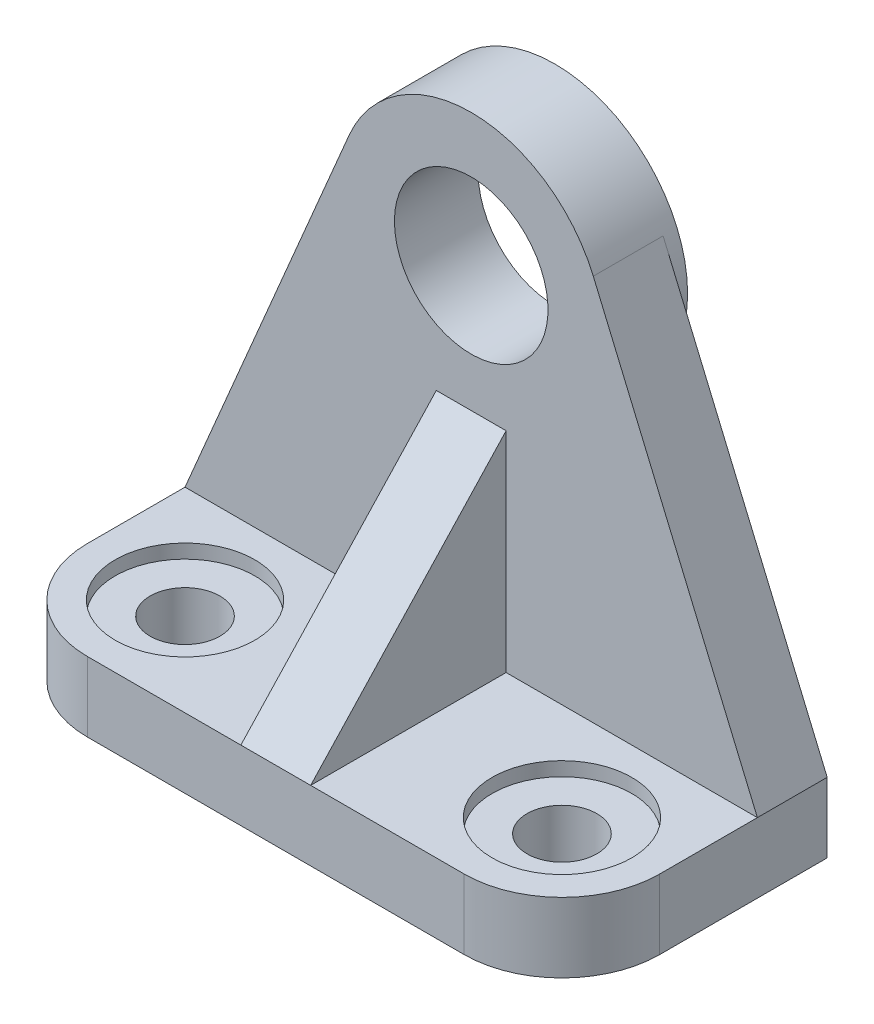
ISO-10303-21;
HEADER;
FILE_DESCRIPTION(('STEP AP214'),'2;1');
FILE_NAME('part.step','',(''),(''),'','','');
FILE_SCHEMA(('AUTOMOTIVE_DESIGN { 1 0 10303 214 1 1 1 1 }'));
ENDSEC;
DATA;
#1=APPLICATION_CONTEXT('core data for automotive mechanical design processes');
#2=APPLICATION_PROTOCOL_DEFINITION('international standard','automotive_design',2000,#1);
#3=PRODUCT_CONTEXT('',#1,'mechanical');
#4=PRODUCT('Part','Part','',(#3));
#5=PRODUCT_RELATED_PRODUCT_CATEGORY('part','',(#4));
#6=PRODUCT_DEFINITION_FORMATION('','',#4);
#7=PRODUCT_DEFINITION_CONTEXT('part definition',#1,'design');
#8=PRODUCT_DEFINITION('design','',#6,#7);
#9=PRODUCT_DEFINITION_SHAPE('','',#8);
#10=(LENGTH_UNIT() NAMED_UNIT(*) SI_UNIT(.MILLI.,.METRE.));
#11=(NAMED_UNIT(*) PLANE_ANGLE_UNIT() SI_UNIT($,.RADIAN.));
#12=(NAMED_UNIT(*) SI_UNIT($,.STERADIAN.) SOLID_ANGLE_UNIT());
#13=UNCERTAINTY_MEASURE_WITH_UNIT(LENGTH_MEASURE(1.E-05),#10,'distance_accuracy_value','');
#14=(GEOMETRIC_REPRESENTATION_CONTEXT(3) GLOBAL_UNCERTAINTY_ASSIGNED_CONTEXT((#13)) GLOBAL_UNIT_ASSIGNED_CONTEXT((#10,
#11,#12)) REPRESENTATION_CONTEXT('',''));
#15=CARTESIAN_POINT('',(0.,0.,0.));
#16=DIRECTION('',(0.,0.,1.));
#17=DIRECTION('',(1.,0.,0.));
#18=AXIS2_PLACEMENT_3D('',#15,#16,#17);
#19=CARTESIAN_POINT('',(0.,10.,0.));
#20=DIRECTION('',(0.,1.,0.));
#21=DIRECTION('',(0.,0.,1.));
#22=AXIS2_PLACEMENT_3D('',#19,#20,#21);
#23=PLANE('',#22);
#24=CARTESIAN_POINT('',(-27.,10.,5.));
#25=DIRECTION('',(0.,1.,0.));
#26=DIRECTION('',(0.,0.,1.));
#27=AXIS2_PLACEMENT_3D('',#24,#25,#26);
#28=CIRCLE('',#27,10.);
#29=CARTESIAN_POINT('',(-27.,10.,15.));
#30=VERTEX_POINT('',#29);
#31=EDGE_CURVE('E158',#30,#30,#28,.T.);
#32=ORIENTED_EDGE('',*,*,#31,.F.);
#33=EDGE_LOOP('',(#32));
#34=FACE_BOUND('',#33,.T.);
#35=DIRECTION('',(1.,0.,0.));
#36=VECTOR('',#35,1.);
#37=CARTESIAN_POINT('',(-41.,10.,19.));
#38=LINE('',#37,#36);
#39=CARTESIAN_POINT('',(-27.,10.,19.));
#40=VERTEX_POINT('',#39);
#41=CARTESIAN_POINT('',(-5.,10.,19.));
#42=VERTEX_POINT('',#41);
#43=EDGE_CURVE('E137',#40,#42,#38,.T.);
#44=ORIENTED_EDGE('',*,*,#43,.T.);
#45=DIRECTION('',(0.,0.,-1.));
#46=VECTOR('',#45,1.);
#47=CARTESIAN_POINT('',(-5.,10.,0.));
#48=LINE('',#47,#46);
#49=CARTESIAN_POINT('',(-5.,10.,-9.));
#50=VERTEX_POINT('',#49);
#51=EDGE_CURVE('E136',#42,#50,#48,.T.);
#52=ORIENTED_EDGE('',*,*,#51,.T.);
#53=DIRECTION('',(1.,0.,0.));
#54=VECTOR('',#53,1.);
#55=CARTESIAN_POINT('',(0.,10.,-9.));
#56=LINE('',#55,#54);
#57=CARTESIAN_POINT('',(-41.,10.,-9.));
#58=VERTEX_POINT('',#57);
#59=EDGE_CURVE('E122',#58,#50,#56,.T.);
#60=ORIENTED_EDGE('',*,*,#59,.F.);
#61=DIRECTION('',(0.,0.,1.));
#62=VECTOR('',#61,1.);
#63=CARTESIAN_POINT('',(-41.,10.,-19.));
#64=LINE('',#63,#62);
#65=CARTESIAN_POINT('',(-41.,10.,5.));
#66=VERTEX_POINT('',#65);
#67=EDGE_CURVE('E201',#58,#66,#64,.T.);
#68=ORIENTED_EDGE('',*,*,#67,.T.);
#69=CARTESIAN_POINT('',(-27.,10.,5.));
#70=DIRECTION('',(0.,1.,0.));
#71=DIRECTION('',(0.,0.,1.));
#72=AXIS2_PLACEMENT_3D('',#69,#70,#71);
#73=CIRCLE('',#72,14.);
#74=EDGE_CURVE('E235',#66,#40,#73,.T.);
#75=ORIENTED_EDGE('',*,*,#74,.T.);
#76=EDGE_LOOP('',(#44,#52,#60,#68,#75));
#77=FACE_BOUND('',#76,.T.);
#78=ADVANCED_FACE('F33',(#34,#77),#23,.T.);
#79=CARTESIAN_POINT('',(41.,10.,-19.));
#80=DIRECTION('',(-1.,0.,0.));
#81=DIRECTION('',(0.,0.,1.));
#82=AXIS2_PLACEMENT_3D('',#79,#80,#81);
#83=PLANE('',#82);
#84=DIRECTION('',(0.,0.,-1.));
#85=VECTOR('',#84,1.);
#86=CARTESIAN_POINT('',(41.,10.,-19.));
#87=LINE('',#86,#85);
#88=CARTESIAN_POINT('',(41.,10.,5.));
#89=VERTEX_POINT('',#88);
#90=CARTESIAN_POINT('',(41.,10.,-9.));
#91=VERTEX_POINT('',#90);
#92=EDGE_CURVE('E198',#89,#91,#87,.T.);
#93=ORIENTED_EDGE('',*,*,#92,.F.);
#94=DIRECTION('',(0.,-1.,0.));
#95=VECTOR('',#94,1.);
#96=CARTESIAN_POINT('',(41.,10.,5.));
#97=LINE('',#96,#95);
#98=CARTESIAN_POINT('',(41.,0.,5.));
#99=VERTEX_POINT('',#98);
#100=EDGE_CURVE('E221',#89,#99,#97,.T.);
#101=ORIENTED_EDGE('',*,*,#100,.T.);
#102=DIRECTION('',(0.,0.,-1.));
#103=VECTOR('',#102,1.);
#104=CARTESIAN_POINT('',(41.,0.,-19.));
#105=LINE('',#104,#103);
#106=CARTESIAN_POINT('',(41.,0.,-19.));
#107=VERTEX_POINT('',#106);
#108=EDGE_CURVE('E193',#99,#107,#105,.T.);
#109=ORIENTED_EDGE('',*,*,#108,.T.);
#110=DIRECTION('',(0.,-1.,0.));
#111=VECTOR('',#110,1.);
#112=CARTESIAN_POINT('',(41.,10.,-19.));
#113=LINE('',#112,#111);
#114=CARTESIAN_POINT('',(41.,10.,-19.));
#115=VERTEX_POINT('',#114);
#116=EDGE_CURVE('E218',#115,#107,#113,.T.);
#117=ORIENTED_EDGE('',*,*,#116,.F.);
#118=DIRECTION('',(0.,0.,-1.));
#119=VECTOR('',#118,1.);
#120=CARTESIAN_POINT('',(41.,10.,-9.));
#121=LINE('',#120,#119);
#122=EDGE_CURVE('E190',#91,#115,#121,.T.);
#123=ORIENTED_EDGE('',*,*,#122,.F.);
#124=EDGE_LOOP('',(#93,#101,#109,#117,#123));
#125=FACE_BOUND('',#124,.T.);
#126=ADVANCED_FACE('F244',(#125),#83,.F.);
#127=CARTESIAN_POINT('',(-41.,10.,-19.));
#128=DIRECTION('',(0.,0.,1.));
#129=DIRECTION('',(1.,0.,0.));
#130=AXIS2_PLACEMENT_3D('',#127,#128,#129);
#131=PLANE('',#130);
#132=DIRECTION('',(-1.,0.,0.));
#133=VECTOR('',#132,1.);
#134=CARTESIAN_POINT('',(-41.,0.,-19.));
#135=LINE('',#134,#133);
#136=CARTESIAN_POINT('',(-41.,0.,-19.));
#137=VERTEX_POINT('',#136);
#138=EDGE_CURVE('E210',#107,#137,#135,.T.);
#139=ORIENTED_EDGE('',*,*,#138,.T.);
#140=DIRECTION('',(0.,-1.,0.));
#141=VECTOR('',#140,1.);
#142=CARTESIAN_POINT('',(-41.,10.,-19.));
#143=LINE('',#142,#141);
#144=CARTESIAN_POINT('',(-41.,10.,-19.));
#145=VERTEX_POINT('',#144);
#146=EDGE_CURVE('E208',#145,#137,#143,.T.);
#147=ORIENTED_EDGE('',*,*,#146,.F.);
#148=DIRECTION('',(0.390511010966112,0.920598256740814,0.));
#149=VECTOR('',#148,1.);
#150=CARTESIAN_POINT('',(-38.3425847222182,16.2646424901311,-19.));
#151=LINE('',#150,#149);
#152=CARTESIAN_POINT('',(-17.4913668780755,65.4197092083561,-19.));
#153=VERTEX_POINT('',#152);
#154=EDGE_CURVE('E176',#145,#153,#151,.T.);
#155=ORIENTED_EDGE('',*,*,#154,.T.);
#156=CARTESIAN_POINT('',(0.,58.,-19.));
#157=DIRECTION('',(0.,0.,-1.));
#158=DIRECTION('',(-1.,0.,0.));
#159=AXIS2_PLACEMENT_3D('',#156,#157,#158);
#160=CIRCLE('',#159,19.);
#161=CARTESIAN_POINT('',(17.4913668780755,65.4197092083561,-19.));
#162=VERTEX_POINT('',#161);
#163=EDGE_CURVE('E185',#162,#153,#160,.T.);
#164=ORIENTED_EDGE('',*,*,#163,.F.);
#165=DIRECTION('',(-0.390511010966112,0.920598256740814,0.));
#166=VECTOR('',#165,1.);
#167=CARTESIAN_POINT('',(38.3425847222182,16.264642490131,-19.));
#168=LINE('',#167,#166);
#169=EDGE_CURVE('E187',#115,#162,#168,.T.);
#170=ORIENTED_EDGE('',*,*,#169,.F.);
#171=ORIENTED_EDGE('',*,*,#116,.T.);
#172=EDGE_LOOP('',(#139,#147,#155,#164,#170,#171));
#173=FACE_BOUND('',#172,.T.);
#174=ADVANCED_FACE('F257',(#173),#131,.F.);
#175=CARTESIAN_POINT('',(-41.,10.,-19.));
#176=DIRECTION('',(1.,0.,0.));
#177=DIRECTION('',(0.,0.,-1.));
#178=AXIS2_PLACEMENT_3D('',#175,#176,#177);
#179=PLANE('',#178);
#180=DIRECTION('',(0.,0.,1.));
#181=VECTOR('',#180,1.);
#182=CARTESIAN_POINT('',(-41.,0.,-19.));
#183=LINE('',#182,#181);
#184=CARTESIAN_POINT('',(-41.,0.,5.));
#185=VERTEX_POINT('',#184);
#186=EDGE_CURVE('E212',#137,#185,#183,.T.);
#187=ORIENTED_EDGE('',*,*,#186,.T.);
#188=DIRECTION('',(0.,-1.,0.));
#189=VECTOR('',#188,1.);
#190=CARTESIAN_POINT('',(-41.,10.,5.));
#191=LINE('',#190,#189);
#192=EDGE_CURVE('E11',#185,#66,#191,.F.);
#193=ORIENTED_EDGE('',*,*,#192,.T.);
#194=ORIENTED_EDGE('',*,*,#67,.F.);
#195=EDGE_CURVE('E203',#145,#58,#64,.T.);
#196=ORIENTED_EDGE('',*,*,#195,.F.);
#197=ORIENTED_EDGE('',*,*,#146,.T.);
#198=EDGE_LOOP('',(#187,#193,#194,#196,#197));
#199=FACE_BOUND('',#198,.T.);
#200=ADVANCED_FACE('F478',(#199),#179,.F.);
#201=CARTESIAN_POINT('',(-41.,10.,19.));
#202=DIRECTION('',(0.,0.,-1.));
#203=DIRECTION('',(-1.,0.,0.));
#204=AXIS2_PLACEMENT_3D('',#201,#202,#203);
#205=PLANE('',#204);
#206=CARTESIAN_POINT('',(5.,10.,19.));
#207=VERTEX_POINT('',#206);
#208=CARTESIAN_POINT('',(27.,10.,19.));
#209=VERTEX_POINT('',#208);
#210=EDGE_CURVE('E206',#207,#209,#38,.T.);
#211=ORIENTED_EDGE('',*,*,#210,.F.);
#212=DIRECTION('',(-1.,0.,0.));
#213=VECTOR('',#212,1.);
#214=CARTESIAN_POINT('',(0.,10.,19.));
#215=LINE('',#214,#213);
#216=EDGE_CURVE('E55',#42,#207,#215,.F.);
#217=ORIENTED_EDGE('',*,*,#216,.F.);
#218=ORIENTED_EDGE('',*,*,#43,.F.);
#219=DIRECTION('',(0.,-1.,0.));
#220=VECTOR('',#219,1.);
#221=CARTESIAN_POINT('',(-27.,10.,19.));
#222=LINE('',#221,#220);
#223=CARTESIAN_POINT('',(-27.,0.,19.));
#224=VERTEX_POINT('',#223);
#225=EDGE_CURVE('E229',#40,#224,#222,.T.);
#226=ORIENTED_EDGE('',*,*,#225,.T.);
#227=DIRECTION('',(1.,0.,0.));
#228=VECTOR('',#227,1.);
#229=CARTESIAN_POINT('',(-41.,0.,19.));
#230=LINE('',#229,#228);
#231=CARTESIAN_POINT('',(27.,0.,19.));
#232=VERTEX_POINT('',#231);
#233=EDGE_CURVE('E202',#224,#232,#230,.T.);
#234=ORIENTED_EDGE('',*,*,#233,.T.);
#235=DIRECTION('',(0.,-1.,0.));
#236=VECTOR('',#235,1.);
#237=CARTESIAN_POINT('',(27.,10.,19.));
#238=LINE('',#237,#236);
#239=EDGE_CURVE('E232',#232,#209,#238,.F.);
#240=ORIENTED_EDGE('',*,*,#239,.T.);
#241=EDGE_LOOP('',(#211,#217,#218,#226,#234,#240));
#242=FACE_BOUND('',#241,.T.);
#243=ADVANCED_FACE('F294',(#242),#205,.F.);
#244=CARTESIAN_POINT('',(27.,10.,5.));
#245=DIRECTION('',(0.,-1.,0.));
#246=DIRECTION('',(0.,0.,1.));
#247=AXIS2_PLACEMENT_3D('',#244,#245,#246);
#248=CIRCLE('',#247,10.);
#249=CARTESIAN_POINT('',(27.,10.,15.));
#250=VERTEX_POINT('',#249);
#251=EDGE_CURVE('E271',#250,#250,#248,.T.);
#252=ORIENTED_EDGE('',*,*,#251,.T.);
#253=EDGE_LOOP('',(#252));
#254=FACE_BOUND('',#253,.T.);
#255=DIRECTION('',(0.,0.,-1.));
#256=VECTOR('',#255,1.);
#257=CARTESIAN_POINT('',(5.,10.,0.));
#258=LINE('',#257,#256);
#259=CARTESIAN_POINT('',(5.,10.,-9.));
#260=VERTEX_POINT('',#259);
#261=EDGE_CURVE('E48',#207,#260,#258,.T.);
#262=ORIENTED_EDGE('',*,*,#261,.F.);
#263=ORIENTED_EDGE('',*,*,#210,.T.);
#264=CARTESIAN_POINT('',(27.,10.,5.));
#265=DIRECTION('',(0.,1.,0.));
#266=DIRECTION('',(0.,0.,1.));
#267=AXIS2_PLACEMENT_3D('',#264,#265,#266);
#268=CIRCLE('',#267,14.);
#269=EDGE_CURVE('E41',#209,#89,#268,.T.);
#270=ORIENTED_EDGE('',*,*,#269,.T.);
#271=ORIENTED_EDGE('',*,*,#92,.T.);
#272=EDGE_CURVE('E133',#260,#91,#56,.T.);
#273=ORIENTED_EDGE('',*,*,#272,.F.);
#274=EDGE_LOOP('',(#262,#263,#270,#271,#273));
#275=FACE_BOUND('',#274,.T.);
#276=ADVANCED_FACE('F238',(#254,#275),#23,.T.);
#277=CARTESIAN_POINT('',(0.,0.,0.));
#278=DIRECTION('',(0.,1.,0.));
#279=DIRECTION('',(0.,0.,1.));
#280=AXIS2_PLACEMENT_3D('',#277,#278,#279);
#281=PLANE('',#280);
#282=CARTESIAN_POINT('',(27.,0.,5.));
#283=DIRECTION('',(0.,-1.,0.));
#284=DIRECTION('',(0.,0.,1.));
#285=AXIS2_PLACEMENT_3D('',#282,#283,#284);
#286=CIRCLE('',#285,5.);
#287=CARTESIAN_POINT('',(27.,0.,10.));
#288=VERTEX_POINT('',#287);
#289=EDGE_CURVE('E274',#288,#288,#286,.T.);
#290=ORIENTED_EDGE('',*,*,#289,.F.);
#291=EDGE_LOOP('',(#290));
#292=FACE_BOUND('',#291,.T.);
#293=CARTESIAN_POINT('',(27.,0.,5.));
#294=DIRECTION('',(0.,1.,0.));
#295=DIRECTION('',(0.,0.,1.));
#296=AXIS2_PLACEMENT_3D('',#293,#294,#295);
#297=CIRCLE('',#296,14.);
#298=EDGE_CURVE('E226',#99,#232,#297,.F.);
#299=ORIENTED_EDGE('',*,*,#298,.T.);
#300=ORIENTED_EDGE('',*,*,#233,.F.);
#301=CARTESIAN_POINT('',(-27.,0.,5.));
#302=DIRECTION('',(0.,1.,0.));
#303=DIRECTION('',(0.,0.,1.));
#304=AXIS2_PLACEMENT_3D('',#301,#302,#303);
#305=CIRCLE('',#304,14.);
#306=EDGE_CURVE('E224',#224,#185,#305,.F.);
#307=ORIENTED_EDGE('',*,*,#306,.T.);
#308=ORIENTED_EDGE('',*,*,#186,.F.);
#309=ORIENTED_EDGE('',*,*,#138,.F.);
#310=ORIENTED_EDGE('',*,*,#108,.F.);
#311=EDGE_LOOP('',(#299,#300,#307,#308,#309,#310));
#312=FACE_BOUND('',#311,.T.);
#313=CARTESIAN_POINT('',(-27.,0.,5.));
#314=DIRECTION('',(0.,1.,0.));
#315=DIRECTION('',(0.,0.,1.));
#316=AXIS2_PLACEMENT_3D('',#313,#314,#315);
#317=CIRCLE('',#316,5.);
#318=CARTESIAN_POINT('',(-27.,0.,10.));
#319=VERTEX_POINT('',#318);
#320=EDGE_CURVE('E155',#319,#319,#317,.T.);
#321=ORIENTED_EDGE('',*,*,#320,.T.);
#322=EDGE_LOOP('',(#321));
#323=FACE_BOUND('',#322,.T.);
#324=ADVANCED_FACE('F250',(#292,#312,#323),#281,.F.);
#325=CARTESIAN_POINT('',(38.3425847222182,16.264642490131,-9.));
#326=DIRECTION('',(-0.920598256740814,-0.390511010966112,0.));
#327=DIRECTION('',(0.390511010966112,-0.920598256740814,0.));
#328=AXIS2_PLACEMENT_3D('',#325,#326,#327);
#329=PLANE('',#328);
#330=ORIENTED_EDGE('',*,*,#169,.T.);
#331=DIRECTION('',(0.,0.,-1.));
#332=VECTOR('',#331,1.);
#333=CARTESIAN_POINT('',(17.4913668780755,65.4197092083561,-9.));
#334=LINE('',#333,#332);
#335=CARTESIAN_POINT('',(17.4913668780755,65.4197092083561,-9.));
#336=VERTEX_POINT('',#335);
#337=EDGE_CURVE('E194',#336,#162,#334,.T.);
#338=ORIENTED_EDGE('',*,*,#337,.F.);
#339=DIRECTION('',(-0.390511010966112,0.920598256740814,0.));
#340=VECTOR('',#339,1.);
#341=CARTESIAN_POINT('',(38.3425847222182,16.264642490131,-9.));
#342=LINE('',#341,#340);
#343=EDGE_CURVE('E179',#91,#336,#342,.T.);
#344=ORIENTED_EDGE('',*,*,#343,.F.);
#345=ORIENTED_EDGE('',*,*,#122,.T.);
#346=EDGE_LOOP('',(#330,#338,#344,#345));
#347=FACE_BOUND('',#346,.T.);
#348=ADVANCED_FACE('F260',(#347),#329,.F.);
#349=CARTESIAN_POINT('',(-38.3425847222182,16.2646424901311,-9.));
#350=DIRECTION('',(-0.920598256740814,0.390511010966112,0.));
#351=DIRECTION('',(-0.390511010966112,-0.920598256740814,0.));
#352=AXIS2_PLACEMENT_3D('',#349,#350,#351);
#353=PLANE('',#352);
#354=ORIENTED_EDGE('',*,*,#154,.F.);
#355=ORIENTED_EDGE('',*,*,#195,.T.);
#356=DIRECTION('',(0.390511010966112,0.920598256740814,0.));
#357=VECTOR('',#356,1.);
#358=CARTESIAN_POINT('',(-38.3425847222182,16.2646424901311,-9.));
#359=LINE('',#358,#357);
#360=CARTESIAN_POINT('',(-17.4913668780755,65.4197092083561,-9.));
#361=VERTEX_POINT('',#360);
#362=EDGE_CURVE('E129',#58,#361,#359,.T.);
#363=ORIENTED_EDGE('',*,*,#362,.T.);
#364=DIRECTION('',(0.,0.,-1.));
#365=VECTOR('',#364,1.);
#366=CARTESIAN_POINT('',(-17.4913668780755,65.4197092083561,-9.));
#367=LINE('',#366,#365);
#368=EDGE_CURVE('E182',#361,#153,#367,.T.);
#369=ORIENTED_EDGE('',*,*,#368,.T.);
#370=EDGE_LOOP('',(#354,#355,#363,#369));
#371=FACE_BOUND('',#370,.T.);
#372=ADVANCED_FACE('F292',(#371),#353,.T.);
#373=CARTESIAN_POINT('',(0.,0.,-9.));
#374=DIRECTION('',(0.,0.,-1.));
#375=DIRECTION('',(-1.,0.,0.));
#376=AXIS2_PLACEMENT_3D('',#373,#374,#375);
#377=PLANE('',#376);
#378=CARTESIAN_POINT('',(0.,58.,-9.));
#379=DIRECTION('',(0.,0.,-1.));
#380=DIRECTION('',(-1.,0.,0.));
#381=AXIS2_PLACEMENT_3D('',#378,#379,#380);
#382=CIRCLE('',#381,11.);
#383=CARTESIAN_POINT('',(-11.,58.,-9.));
#384=VERTEX_POINT('',#383);
#385=EDGE_CURVE('E169',#384,#384,#382,.T.);
#386=ORIENTED_EDGE('',*,*,#385,.T.);
#387=EDGE_LOOP('',(#386));
#388=FACE_BOUND('',#387,.T.);
#389=DIRECTION('',(-1.,0.,0.));
#390=VECTOR('',#389,1.);
#391=CARTESIAN_POINT('',(0.,40.,-9.));
#392=LINE('',#391,#390);
#393=CARTESIAN_POINT('',(-5.,40.,-9.));
#394=VERTEX_POINT('',#393);
#395=CARTESIAN_POINT('',(5.,40.,-9.));
#396=VERTEX_POINT('',#395);
#397=EDGE_CURVE('E151',#394,#396,#392,.F.);
#398=ORIENTED_EDGE('',*,*,#397,.T.);
#399=DIRECTION('',(0.,-1.,0.));
#400=VECTOR('',#399,1.);
#401=CARTESIAN_POINT('',(5.,0.,-9.));
#402=LINE('',#401,#400);
#403=EDGE_CURVE('E146',#396,#260,#402,.T.);
#404=ORIENTED_EDGE('',*,*,#403,.T.);
#405=ORIENTED_EDGE('',*,*,#272,.T.);
#406=ORIENTED_EDGE('',*,*,#343,.T.);
#407=CARTESIAN_POINT('',(0.,58.,-9.));
#408=DIRECTION('',(0.,0.,-1.));
#409=DIRECTION('',(-1.,0.,0.));
#410=AXIS2_PLACEMENT_3D('',#407,#408,#409);
#411=CIRCLE('',#410,19.);
#412=EDGE_CURVE('E172',#361,#336,#411,.T.);
#413=ORIENTED_EDGE('',*,*,#412,.F.);
#414=ORIENTED_EDGE('',*,*,#362,.F.);
#415=ORIENTED_EDGE('',*,*,#59,.T.);
#416=DIRECTION('',(0.,-1.,0.));
#417=VECTOR('',#416,1.);
#418=CARTESIAN_POINT('',(-5.,0.,-9.));
#419=LINE('',#418,#417);
#420=EDGE_CURVE('E126',#394,#50,#419,.T.);
#421=ORIENTED_EDGE('',*,*,#420,.F.);
#422=EDGE_LOOP('',(#398,#404,#405,#406,#413,#414,#415,#421));
#423=FACE_BOUND('',#422,.T.);
#424=ADVANCED_FACE('F124',(#388,#423),#377,.F.);
#425=CARTESIAN_POINT('',(0.,58.,-21.));
#426=DIRECTION('',(0.,0.,1.));
#427=DIRECTION('',(1.,0.,0.));
#428=AXIS2_PLACEMENT_3D('',#425,#426,#427);
#429=CYLINDRICAL_SURFACE('',#428,19.);
#430=CARTESIAN_POINT('',(0.,58.,-21.));
#431=DIRECTION('',(0.,0.,-1.));
#432=DIRECTION('',(-1.,0.,0.));
#433=AXIS2_PLACEMENT_3D('',#430,#431,#432);
#434=CIRCLE('',#433,19.);
#435=CARTESIAN_POINT('',(-19.,58.,-21.));
#436=VERTEX_POINT('',#435);
#437=EDGE_CURVE('E173',#436,#436,#434,.T.);
#438=ORIENTED_EDGE('',*,*,#437,.F.);
#439=EDGE_LOOP('',(#438));
#440=FACE_BOUND('',#439,.T.);
#441=ORIENTED_EDGE('',*,*,#163,.T.);
#442=ORIENTED_EDGE('',*,*,#368,.F.);
#443=ORIENTED_EDGE('',*,*,#412,.T.);
#444=ORIENTED_EDGE('',*,*,#337,.T.);
#445=EDGE_LOOP('',(#441,#442,#443,#444));
#446=FACE_BOUND('',#445,.T.);
#447=ADVANCED_FACE('F311',(#440,#446),#429,.T.);
#448=CARTESIAN_POINT('',(0.,0.,-21.));
#449=DIRECTION('',(0.,0.,-1.));
#450=DIRECTION('',(-1.,0.,0.));
#451=AXIS2_PLACEMENT_3D('',#448,#449,#450);
#452=PLANE('',#451);
#453=ORIENTED_EDGE('',*,*,#437,.T.);
#454=EDGE_LOOP('',(#453));
#455=FACE_BOUND('',#454,.T.);
#456=CARTESIAN_POINT('',(0.,58.,-21.));
#457=DIRECTION('',(0.,0.,-1.));
#458=DIRECTION('',(-1.,0.,0.));
#459=AXIS2_PLACEMENT_3D('',#456,#457,#458);
#460=CIRCLE('',#459,11.);
#461=CARTESIAN_POINT('',(-11.,58.,-21.));
#462=VERTEX_POINT('',#461);
#463=EDGE_CURVE('E164',#462,#462,#460,.T.);
#464=ORIENTED_EDGE('',*,*,#463,.F.);
#465=EDGE_LOOP('',(#464));
#466=FACE_BOUND('',#465,.T.);
#467=ADVANCED_FACE('F315',(#455,#466),#452,.T.);
#468=CARTESIAN_POINT('',(0.,58.,19.));
#469=DIRECTION('',(0.,0.,-1.));
#470=DIRECTION('',(-1.,0.,0.));
#471=AXIS2_PLACEMENT_3D('',#468,#469,#470);
#472=CYLINDRICAL_SURFACE('',#471,11.);
#473=ORIENTED_EDGE('',*,*,#463,.T.);
#474=EDGE_LOOP('',(#473));
#475=FACE_BOUND('',#474,.T.);
#476=ORIENTED_EDGE('',*,*,#385,.F.);
#477=EDGE_LOOP('',(#476));
#478=FACE_BOUND('',#477,.T.);
#479=ADVANCED_FACE('F319',(#475,#478),#472,.F.);
#480=CARTESIAN_POINT('',(27.,10.,5.));
#481=DIRECTION('',(0.,-1.,0.));
#482=DIRECTION('',(0.,0.,-1.));
#483=AXIS2_PLACEMENT_3D('',#480,#481,#482);
#484=CYLINDRICAL_SURFACE('',#483,14.);
#485=ORIENTED_EDGE('',*,*,#269,.F.);
#486=ORIENTED_EDGE('',*,*,#239,.F.);
#487=ORIENTED_EDGE('',*,*,#298,.F.);
#488=ORIENTED_EDGE('',*,*,#100,.F.);
#489=EDGE_LOOP('',(#485,#486,#487,#488));
#490=FACE_BOUND('',#489,.T.);
#491=ADVANCED_FACE('F247',(#490),#484,.T.);
#492=CARTESIAN_POINT('',(-27.,10.,5.));
#493=DIRECTION('',(0.,-1.,0.));
#494=DIRECTION('',(0.,0.,-1.));
#495=AXIS2_PLACEMENT_3D('',#492,#493,#494);
#496=CYLINDRICAL_SURFACE('',#495,14.);
#497=ORIENTED_EDGE('',*,*,#74,.F.);
#498=ORIENTED_EDGE('',*,*,#192,.F.);
#499=ORIENTED_EDGE('',*,*,#306,.F.);
#500=ORIENTED_EDGE('',*,*,#225,.F.);
#501=EDGE_LOOP('',(#497,#498,#499,#500));
#502=FACE_BOUND('',#501,.T.);
#503=ADVANCED_FACE('F35',(#502),#496,.T.);
#504=CARTESIAN_POINT('',(-27.,8.,5.));
#505=DIRECTION('',(0.,1.,0.));
#506=DIRECTION('',(0.,0.,1.));
#507=AXIS2_PLACEMENT_3D('',#504,#505,#506);
#508=CYLINDRICAL_SURFACE('',#507,10.);
#509=CARTESIAN_POINT('',(-27.,8.,5.));
#510=DIRECTION('',(0.,1.,0.));
#511=DIRECTION('',(0.,0.,1.));
#512=AXIS2_PLACEMENT_3D('',#509,#510,#511);
#513=CIRCLE('',#512,10.);
#514=CARTESIAN_POINT('',(-27.,8.,15.));
#515=VERTEX_POINT('',#514);
#516=EDGE_CURVE('E161',#515,#515,#513,.T.);
#517=ORIENTED_EDGE('',*,*,#516,.F.);
#518=EDGE_LOOP('',(#517));
#519=FACE_BOUND('',#518,.T.);
#520=ORIENTED_EDGE('',*,*,#31,.T.);
#521=EDGE_LOOP('',(#520));
#522=FACE_BOUND('',#521,.T.);
#523=ADVANCED_FACE('F324',(#519,#522),#508,.F.);
#524=CARTESIAN_POINT('',(-27.,8.,5.));
#525=DIRECTION('',(0.,1.,0.));
#526=DIRECTION('',(0.,0.,1.));
#527=AXIS2_PLACEMENT_3D('',#524,#525,#526);
#528=PLANE('',#527);
#529=CARTESIAN_POINT('',(-27.,8.,5.));
#530=DIRECTION('',(0.,1.,0.));
#531=DIRECTION('',(0.,0.,1.));
#532=AXIS2_PLACEMENT_3D('',#529,#530,#531);
#533=CIRCLE('',#532,5.);
#534=CARTESIAN_POINT('',(-27.,8.,10.));
#535=VERTEX_POINT('',#534);
#536=EDGE_CURVE('E154',#535,#535,#533,.T.);
#537=ORIENTED_EDGE('',*,*,#536,.F.);
#538=EDGE_LOOP('',(#537));
#539=FACE_BOUND('',#538,.T.);
#540=ORIENTED_EDGE('',*,*,#516,.T.);
#541=EDGE_LOOP('',(#540));
#542=FACE_BOUND('',#541,.T.);
#543=ADVANCED_FACE('F327',(#539,#542),#528,.T.);
#544=CARTESIAN_POINT('',(-27.,0.,5.));
#545=DIRECTION('',(0.,1.,0.));
#546=DIRECTION('',(0.,0.,1.));
#547=AXIS2_PLACEMENT_3D('',#544,#545,#546);
#548=CYLINDRICAL_SURFACE('',#547,5.);
#549=ORIENTED_EDGE('',*,*,#320,.F.);
#550=EDGE_LOOP('',(#549));
#551=FACE_BOUND('',#550,.T.);
#552=ORIENTED_EDGE('',*,*,#536,.T.);
#553=EDGE_LOOP('',(#552));
#554=FACE_BOUND('',#553,.T.);
#555=ADVANCED_FACE('F331',(#551,#554),#548,.F.);
#556=CARTESIAN_POINT('',(0.,10.,19.));
#557=DIRECTION('',(0.,-0.682318250360011,-0.731055268242869));
#558=DIRECTION('',(0.,0.731055268242869,-0.682318250360011));
#559=AXIS2_PLACEMENT_3D('',#556,#557,#558);
#560=PLANE('',#559);
#561=DIRECTION('',(0.,0.731055268242869,-0.682318250360011));
#562=VECTOR('',#561,1.);
#563=CARTESIAN_POINT('',(-5.,10.,19.));
#564=LINE('',#563,#562);
#565=EDGE_CURVE('E144',#42,#394,#564,.T.);
#566=ORIENTED_EDGE('',*,*,#565,.F.);
#567=ORIENTED_EDGE('',*,*,#216,.T.);
#568=DIRECTION('',(0.,0.731055268242869,-0.682318250360011));
#569=VECTOR('',#568,1.);
#570=CARTESIAN_POINT('',(5.,10.,19.));
#571=LINE('',#570,#569);
#572=EDGE_CURVE('E141',#207,#396,#571,.T.);
#573=ORIENTED_EDGE('',*,*,#572,.T.);
#574=ORIENTED_EDGE('',*,*,#397,.F.);
#575=EDGE_LOOP('',(#566,#567,#573,#574));
#576=FACE_BOUND('',#575,.T.);
#577=ADVANCED_FACE('F335',(#576),#560,.F.);
#578=CARTESIAN_POINT('',(5.,38.5,-0.999999999999997));
#579=DIRECTION('',(1.,0.,0.));
#580=DIRECTION('',(0.,0.,-1.));
#581=AXIS2_PLACEMENT_3D('',#578,#579,#580);
#582=PLANE('',#581);
#583=ORIENTED_EDGE('',*,*,#403,.F.);
#584=ORIENTED_EDGE('',*,*,#572,.F.);
#585=ORIENTED_EDGE('',*,*,#261,.T.);
#586=EDGE_LOOP('',(#583,#584,#585));
#587=FACE_BOUND('',#586,.T.);
#588=ADVANCED_FACE('F265',(#587),#582,.T.);
#589=CARTESIAN_POINT('',(-5.,38.5,-0.999999999999997));
#590=DIRECTION('',(1.,0.,0.));
#591=DIRECTION('',(0.,0.,-1.));
#592=AXIS2_PLACEMENT_3D('',#589,#590,#591);
#593=PLANE('',#592);
#594=ORIENTED_EDGE('',*,*,#565,.T.);
#595=ORIENTED_EDGE('',*,*,#420,.T.);
#596=ORIENTED_EDGE('',*,*,#51,.F.);
#597=EDGE_LOOP('',(#594,#595,#596));
#598=FACE_BOUND('',#597,.T.);
#599=ADVANCED_FACE('F143',(#598),#593,.F.);
#600=CARTESIAN_POINT('',(27.,8.,5.));
#601=DIRECTION('',(0.,1.,0.));
#602=DIRECTION('',(0.,0.,1.));
#603=AXIS2_PLACEMENT_3D('',#600,#601,#602);
#604=CYLINDRICAL_SURFACE('',#603,10.);
#605=CARTESIAN_POINT('',(27.,8.,5.));
#606=DIRECTION('',(0.,-1.,0.));
#607=DIRECTION('',(0.,0.,1.));
#608=AXIS2_PLACEMENT_3D('',#605,#606,#607);
#609=CIRCLE('',#608,10.);
#610=CARTESIAN_POINT('',(27.,8.,15.));
#611=VERTEX_POINT('',#610);
#612=EDGE_CURVE('E269',#611,#611,#609,.T.);
#613=ORIENTED_EDGE('',*,*,#612,.T.);
#614=EDGE_LOOP('',(#613));
#615=FACE_BOUND('',#614,.T.);
#616=ORIENTED_EDGE('',*,*,#251,.F.);
#617=EDGE_LOOP('',(#616));
#618=FACE_BOUND('',#617,.T.);
#619=ADVANCED_FACE('F341',(#615,#618),#604,.F.);
#620=CARTESIAN_POINT('',(27.,8.,5.));
#621=DIRECTION('',(0.,1.,0.));
#622=DIRECTION('',(0.,0.,1.));
#623=AXIS2_PLACEMENT_3D('',#620,#621,#622);
#624=PLANE('',#623);
#625=CARTESIAN_POINT('',(27.,8.,5.));
#626=DIRECTION('',(0.,-1.,0.));
#627=DIRECTION('',(0.,0.,1.));
#628=AXIS2_PLACEMENT_3D('',#625,#626,#627);
#629=CIRCLE('',#628,5.);
#630=CARTESIAN_POINT('',(27.,8.,10.));
#631=VERTEX_POINT('',#630);
#632=EDGE_CURVE('E277',#631,#631,#629,.T.);
#633=ORIENTED_EDGE('',*,*,#632,.T.);
#634=EDGE_LOOP('',(#633));
#635=FACE_BOUND('',#634,.T.);
#636=ORIENTED_EDGE('',*,*,#612,.F.);
#637=EDGE_LOOP('',(#636));
#638=FACE_BOUND('',#637,.T.);
#639=ADVANCED_FACE('F346',(#635,#638),#624,.T.);
#640=CARTESIAN_POINT('',(27.,0.,5.));
#641=DIRECTION('',(0.,1.,0.));
#642=DIRECTION('',(0.,0.,1.));
#643=AXIS2_PLACEMENT_3D('',#640,#641,#642);
#644=CYLINDRICAL_SURFACE('',#643,5.);
#645=ORIENTED_EDGE('',*,*,#289,.T.);
#646=EDGE_LOOP('',(#645));
#647=FACE_BOUND('',#646,.T.);
#648=ORIENTED_EDGE('',*,*,#632,.F.);
#649=EDGE_LOOP('',(#648));
#650=FACE_BOUND('',#649,.T.);
#651=ADVANCED_FACE('F283',(#647,#650),#644,.F.);
#652=CLOSED_SHELL('',(#78,#126,#174,#200,#243,#276,#324,#348,#372,#424,#447,#467,#479,#491,#503,
#523,#543,#555,#577,#588,#599,#619,#639,#651));
#653=MANIFOLD_SOLID_BREP('B2',#652);
#654=ADVANCED_BREP_SHAPE_REPRESENTATION('',(#18,#653),#14);
#655=SHAPE_DEFINITION_REPRESENTATION(#9,#654);
ENDSEC;
END-ISO-10303-21;
